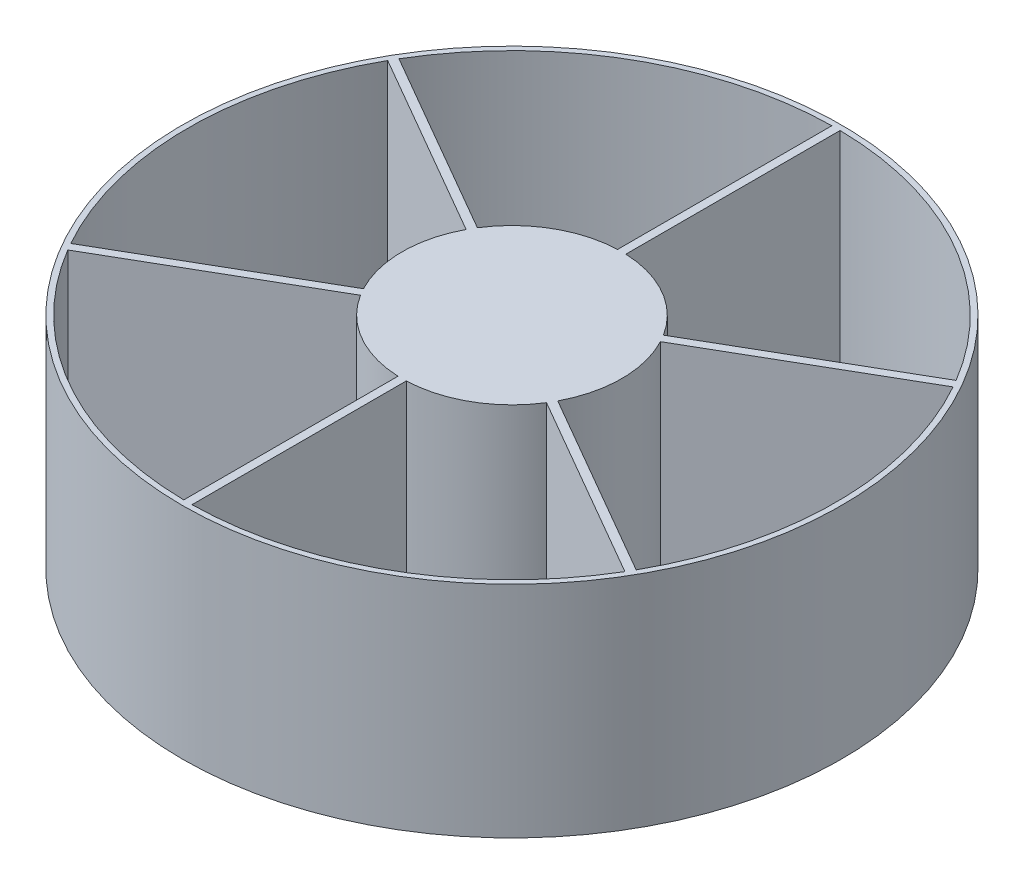
ISO-10303-21;
HEADER;
FILE_DESCRIPTION(('STEP AP214'),'2;1');
FILE_NAME('part.step','',(''),(''),'','','');
FILE_SCHEMA(('AUTOMOTIVE_DESIGN { 1 0 10303 214 1 1 1 1 }'));
ENDSEC;
DATA;
#1=APPLICATION_CONTEXT('core data for automotive mechanical design processes');
#2=APPLICATION_PROTOCOL_DEFINITION('international standard','automotive_design',2000,#1);
#3=PRODUCT_CONTEXT('',#1,'mechanical');
#4=PRODUCT('Part','Part','',(#3));
#5=PRODUCT_RELATED_PRODUCT_CATEGORY('part','',(#4));
#6=PRODUCT_DEFINITION_FORMATION('','',#4);
#7=PRODUCT_DEFINITION_CONTEXT('part definition',#1,'design');
#8=PRODUCT_DEFINITION('design','',#6,#7);
#9=PRODUCT_DEFINITION_SHAPE('','',#8);
#10=(LENGTH_UNIT() NAMED_UNIT(*) SI_UNIT(.MILLI.,.METRE.));
#11=(NAMED_UNIT(*) PLANE_ANGLE_UNIT() SI_UNIT($,.RADIAN.));
#12=(NAMED_UNIT(*) SI_UNIT($,.STERADIAN.) SOLID_ANGLE_UNIT());
#13=UNCERTAINTY_MEASURE_WITH_UNIT(LENGTH_MEASURE(1.E-05),#10,'distance_accuracy_value','');
#14=(GEOMETRIC_REPRESENTATION_CONTEXT(3) GLOBAL_UNCERTAINTY_ASSIGNED_CONTEXT((#13)) GLOBAL_UNIT_ASSIGNED_CONTEXT((#10,
#11,#12)) REPRESENTATION_CONTEXT('',''));
#15=CARTESIAN_POINT('',(0.,0.,0.));
#16=DIRECTION('',(0.,0.,1.));
#17=DIRECTION('',(1.,0.,0.));
#18=AXIS2_PLACEMENT_3D('',#15,#16,#17);
#19=CARTESIAN_POINT('',(0.,80.,0.));
#20=DIRECTION('',(0.,-1.,0.));
#21=DIRECTION('',(0.,0.,-1.));
#22=AXIS2_PLACEMENT_3D('',#19,#20,#21);
#23=CYLINDRICAL_SURFACE('',#22,38.);
#24=CARTESIAN_POINT('',(0.,0.,0.));
#25=DIRECTION('',(0.,1.,0.));
#26=DIRECTION('',(0.,0.,1.));
#27=AXIS2_PLACEMENT_3D('',#24,#25,#26);
#28=CIRCLE('',#27,38.);
#29=CARTESIAN_POINT('',(0.,0.,38.));
#30=VERTEX_POINT('',#29);
#31=EDGE_CURVE('E390',#30,#30,#28,.T.);
#32=ORIENTED_EDGE('',*,*,#31,.F.);
#33=EDGE_LOOP('',(#32));
#34=FACE_BOUND('',#33,.T.);
#35=CARTESIAN_POINT('',(0.,75.,0.));
#36=DIRECTION('',(0.,-1.,0.));
#37=DIRECTION('',(0.,0.,-1.));
#38=AXIS2_PLACEMENT_3D('',#35,#36,#37);
#39=CIRCLE('',#38,38.);
#40=CARTESIAN_POINT('',(0.,75.,-38.));
#41=VERTEX_POINT('',#40);
#42=EDGE_CURVE('E231',#41,#41,#39,.T.);
#43=ORIENTED_EDGE('',*,*,#42,.F.);
#44=EDGE_LOOP('',(#43));
#45=FACE_BOUND('',#44,.T.);
#46=ADVANCED_FACE('F43',(#34,#45),#23,.F.);
#47=CARTESIAN_POINT('',(0.,2.,0.));
#48=DIRECTION('',(0.,1.,0.));
#49=DIRECTION('',(0.,0.,1.));
#50=AXIS2_PLACEMENT_3D('',#47,#48,#49);
#51=PLANE('',#50);
#52=DIRECTION('',(-0.866025403784435,0.,0.500000000000006));
#53=VECTOR('',#52,1.);
#54=CARTESIAN_POINT('',(102.932740714858,2.,-57.6961947525815));
#55=LINE('',#54,#53);
#56=CARTESIAN_POINT('',(102.932740714858,2.,-57.6961947525815));
#57=VERTEX_POINT('',#56);
#58=CARTESIAN_POINT('',(35.3666506178744,2.,-18.6868944469969));
#59=VERTEX_POINT('',#58);
#60=EDGE_CURVE('E244',#57,#59,#55,.T.);
#61=ORIENTED_EDGE('',*,*,#60,.T.);
#62=CARTESIAN_POINT('',(0.,2.,0.));
#63=DIRECTION('',(0.,1.,0.));
#64=DIRECTION('',(0.,0.,1.));
#65=AXIS2_PLACEMENT_3D('',#62,#63,#64);
#66=CIRCLE('',#65,40.);
#67=CARTESIAN_POINT('',(35.3666506178748,2.,18.6868944469962));
#68=VERTEX_POINT('',#67);
#69=EDGE_CURVE('E928',#68,#59,#66,.T.);
#70=ORIENTED_EDGE('',*,*,#69,.F.);
#71=DIRECTION('',(0.866025403784441,0.,0.499999999999996));
#72=VECTOR('',#71,1.);
#73=CARTESIAN_POINT('',(102.932740714859,2.,57.69619475258));
#74=LINE('',#73,#72);
#75=CARTESIAN_POINT('',(102.932740714859,2.,57.69619475258));
#76=VERTEX_POINT('',#75);
#77=EDGE_CURVE('E268',#68,#76,#74,.T.);
#78=ORIENTED_EDGE('',*,*,#77,.T.);
#79=CARTESIAN_POINT('',(0.,2.,0.));
#80=DIRECTION('',(0.,1.,0.));
#81=DIRECTION('',(0.,0.,1.));
#82=AXIS2_PLACEMENT_3D('',#79,#80,#81);
#83=CIRCLE('',#82,118.);
#84=EDGE_CURVE('E942',#76,#57,#83,.T.);
#85=ORIENTED_EDGE('',*,*,#84,.T.);
#86=EDGE_LOOP('',(#61,#70,#78,#85));
#87=FACE_BOUND('',#86,.T.);
#88=ADVANCED_FACE('F415',(#87),#51,.T.);
#89=CARTESIAN_POINT('',(0.,80.,0.));
#90=DIRECTION('',(0.,-1.,0.));
#91=DIRECTION('',(0.,0.,-1.));
#92=AXIS2_PLACEMENT_3D('',#89,#90,#91);
#93=CYLINDRICAL_SURFACE('',#92,118.);
#94=DIRECTION('',(0.,1.,0.));
#95=VECTOR('',#94,1.);
#96=CARTESIAN_POINT('',(102.932740714858,-78.6306305439,-57.6961947525815));
#97=LINE('',#96,#95);
#98=CARTESIAN_POINT('',(102.932740714858,80.,-57.6961947525815));
#99=VERTEX_POINT('',#98);
#100=EDGE_CURVE('E248',#57,#99,#97,.T.);
#101=ORIENTED_EDGE('',*,*,#100,.F.);
#102=ORIENTED_EDGE('',*,*,#84,.F.);
#103=DIRECTION('',(0.,1.,0.));
#104=VECTOR('',#103,1.);
#105=CARTESIAN_POINT('',(102.932740714859,-78.6306305438999,57.69619475258));
#106=LINE('',#105,#104);
#107=CARTESIAN_POINT('',(102.932740714859,80.,57.69619475258));
#108=VERTEX_POINT('',#107);
#109=EDGE_CURVE('E274',#76,#108,#106,.T.);
#110=ORIENTED_EDGE('',*,*,#109,.T.);
#111=CARTESIAN_POINT('',(0.,80.,0.));
#112=DIRECTION('',(0.,1.,0.));
#113=DIRECTION('',(0.,0.,1.));
#114=AXIS2_PLACEMENT_3D('',#111,#112,#113);
#115=CIRCLE('',#114,118.);
#116=EDGE_CURVE('E969',#108,#99,#115,.T.);
#117=ORIENTED_EDGE('',*,*,#116,.T.);
#118=EDGE_LOOP('',(#101,#102,#110,#117));
#119=FACE_BOUND('',#118,.T.);
#120=ADVANCED_FACE('F421',(#119),#93,.F.);
#121=CARTESIAN_POINT('',(0.,80.,0.));
#122=DIRECTION('',(0.,-1.,0.));
#123=DIRECTION('',(0.,0.,-1.));
#124=AXIS2_PLACEMENT_3D('',#121,#122,#123);
#125=CYLINDRICAL_SURFACE('',#124,40.);
#126=ORIENTED_EDGE('',*,*,#69,.T.);
#127=DIRECTION('',(0.,1.,0.));
#128=VECTOR('',#127,1.);
#129=CARTESIAN_POINT('',(35.3666506178744,-78.6306305439,-18.6868944469969));
#130=LINE('',#129,#128);
#131=CARTESIAN_POINT('',(35.3666506178744,80.,-18.6868944469969));
#132=VERTEX_POINT('',#131);
#133=EDGE_CURVE('E255',#59,#132,#130,.T.);
#134=ORIENTED_EDGE('',*,*,#133,.T.);
#135=CARTESIAN_POINT('',(0.,80.,0.));
#136=DIRECTION('',(0.,1.,0.));
#137=DIRECTION('',(0.,0.,1.));
#138=AXIS2_PLACEMENT_3D('',#135,#136,#137);
#139=CIRCLE('',#138,40.);
#140=CARTESIAN_POINT('',(35.3666506178748,80.,18.6868944469962));
#141=VERTEX_POINT('',#140);
#142=EDGE_CURVE('E963',#141,#132,#139,.T.);
#143=ORIENTED_EDGE('',*,*,#142,.F.);
#144=DIRECTION('',(0.,1.,0.));
#145=VECTOR('',#144,1.);
#146=CARTESIAN_POINT('',(35.3666506178748,-78.6306305438999,18.6868944469962));
#147=LINE('',#146,#145);
#148=EDGE_CURVE('E279',#68,#141,#147,.T.);
#149=ORIENTED_EDGE('',*,*,#148,.F.);
#150=EDGE_LOOP('',(#126,#134,#143,#149));
#151=FACE_BOUND('',#150,.T.);
#152=ADVANCED_FACE('F433',(#151),#125,.T.);
#153=DIRECTION('',(-0.866025403784441,0.,-0.499999999999996));
#154=VECTOR('',#153,1.);
#155=CARTESIAN_POINT('',(101.432740714859,2.,60.2942709639334));
#156=LINE('',#155,#154);
#157=CARTESIAN_POINT('',(101.432740714859,2.,60.2942709639334));
#158=VERTEX_POINT('',#157);
#159=CARTESIAN_POINT('',(33.8666506178748,2.,21.2849706583495));
#160=VERTEX_POINT('',#159);
#161=EDGE_CURVE('E265',#158,#160,#156,.T.);
#162=ORIENTED_EDGE('',*,*,#161,.T.);
#163=CARTESIAN_POINT('',(1.49999999999997,2.,39.9718651053463));
#164=VERTEX_POINT('',#163);
#165=EDGE_CURVE('E924',#164,#160,#66,.T.);
#166=ORIENTED_EDGE('',*,*,#165,.F.);
#167=DIRECTION('',(0.,0.,1.));
#168=VECTOR('',#167,1.);
#169=CARTESIAN_POINT('',(1.4999999999996,2.,117.990465716515));
#170=LINE('',#169,#168);
#171=CARTESIAN_POINT('',(1.4999999999996,2.,117.990465716515));
#172=VERTEX_POINT('',#171);
#173=EDGE_CURVE('E290',#164,#172,#170,.T.);
#174=ORIENTED_EDGE('',*,*,#173,.T.);
#175=EDGE_CURVE('E944',#172,#158,#83,.T.);
#176=ORIENTED_EDGE('',*,*,#175,.T.);
#177=EDGE_LOOP('',(#162,#166,#174,#176));
#178=FACE_BOUND('',#177,.T.);
#179=ADVANCED_FACE('F424',(#178),#51,.T.);
#180=DIRECTION('',(0.,1.,0.));
#181=VECTOR('',#180,1.);
#182=CARTESIAN_POINT('',(101.432740714859,-78.6306305438999,60.2942709639334));
#183=LINE('',#182,#181);
#184=CARTESIAN_POINT('',(101.432740714859,80.,60.2942709639334));
#185=VERTEX_POINT('',#184);
#186=EDGE_CURVE('E269',#158,#185,#183,.T.);
#187=ORIENTED_EDGE('',*,*,#186,.F.);
#188=ORIENTED_EDGE('',*,*,#175,.F.);
#189=DIRECTION('',(0.,1.,0.));
#190=VECTOR('',#189,1.);
#191=CARTESIAN_POINT('',(1.4999999999996,-76.0857851029128,117.990465716515));
#192=LINE('',#191,#190);
#193=CARTESIAN_POINT('',(1.4999999999996,80.,117.990465716515));
#194=VERTEX_POINT('',#193);
#195=EDGE_CURVE('E296',#172,#194,#192,.T.);
#196=ORIENTED_EDGE('',*,*,#195,.T.);
#197=EDGE_CURVE('E971',#194,#185,#115,.T.);
#198=ORIENTED_EDGE('',*,*,#197,.T.);
#199=EDGE_LOOP('',(#187,#188,#196,#198));
#200=FACE_BOUND('',#199,.T.);
#201=ADVANCED_FACE('F651',(#200),#93,.F.);
#202=ORIENTED_EDGE('',*,*,#165,.T.);
#203=DIRECTION('',(0.,1.,0.));
#204=VECTOR('',#203,1.);
#205=CARTESIAN_POINT('',(33.8666506178748,-78.6306305438999,21.2849706583495));
#206=LINE('',#205,#204);
#207=CARTESIAN_POINT('',(33.8666506178748,80.,21.2849706583495));
#208=VERTEX_POINT('',#207);
#209=EDGE_CURVE('E276',#160,#208,#206,.T.);
#210=ORIENTED_EDGE('',*,*,#209,.T.);
#211=CARTESIAN_POINT('',(1.49999999999997,80.,39.9718651053463));
#212=VERTEX_POINT('',#211);
#213=EDGE_CURVE('E959',#212,#208,#139,.T.);
#214=ORIENTED_EDGE('',*,*,#213,.F.);
#215=DIRECTION('',(0.,1.,0.));
#216=VECTOR('',#215,1.);
#217=CARTESIAN_POINT('',(1.49999999999997,-76.0857851029128,39.9718651053463));
#218=LINE('',#217,#216);
#219=EDGE_CURVE('E301',#164,#212,#218,.T.);
#220=ORIENTED_EDGE('',*,*,#219,.F.);
#221=EDGE_LOOP('',(#202,#210,#214,#220));
#222=FACE_BOUND('',#221,.T.);
#223=ADVANCED_FACE('F661',(#222),#125,.T.);
#224=DIRECTION('',(0.,0.,-1.));
#225=VECTOR('',#224,1.);
#226=CARTESIAN_POINT('',(-1.5000000000004,2.,117.990465716515));
#227=LINE('',#226,#225);
#228=CARTESIAN_POINT('',(-1.5000000000004,2.,117.990465716515));
#229=VERTEX_POINT('',#228);
#230=CARTESIAN_POINT('',(-1.50000000000002,2.,39.9718651053463));
#231=VERTEX_POINT('',#230);
#232=EDGE_CURVE('E287',#229,#231,#227,.T.);
#233=ORIENTED_EDGE('',*,*,#232,.T.);
#234=CARTESIAN_POINT('',(-33.8666506178746,2.,21.2849706583499));
#235=VERTEX_POINT('',#234);
#236=EDGE_CURVE('E922',#235,#231,#66,.T.);
#237=ORIENTED_EDGE('',*,*,#236,.F.);
#238=DIRECTION('',(-0.866025403784439,0.,0.5));
#239=VECTOR('',#238,1.);
#240=CARTESIAN_POINT('',(-101.432740714858,2.,60.2942709639341));
#241=LINE('',#240,#239);
#242=CARTESIAN_POINT('',(-101.432740714858,2.,60.2942709639341));
#243=VERTEX_POINT('',#242);
#244=EDGE_CURVE('E312',#235,#243,#241,.T.);
#245=ORIENTED_EDGE('',*,*,#244,.T.);
#246=EDGE_CURVE('E947',#243,#229,#83,.T.);
#247=ORIENTED_EDGE('',*,*,#246,.T.);
#248=EDGE_LOOP('',(#233,#237,#245,#247));
#249=FACE_BOUND('',#248,.T.);
#250=ADVANCED_FACE('F671',(#249),#51,.T.);
#251=DIRECTION('',(0.,1.,0.));
#252=VECTOR('',#251,1.);
#253=CARTESIAN_POINT('',(-1.5000000000004,-76.0857851029128,117.990465716515));
#254=LINE('',#253,#252);
#255=CARTESIAN_POINT('',(-1.5000000000004,80.,117.990465716515));
#256=VERTEX_POINT('',#255);
#257=EDGE_CURVE('E291',#229,#256,#254,.T.);
#258=ORIENTED_EDGE('',*,*,#257,.F.);
#259=ORIENTED_EDGE('',*,*,#246,.F.);
#260=DIRECTION('',(0.,1.,0.));
#261=VECTOR('',#260,1.);
#262=CARTESIAN_POINT('',(-101.432740714858,-78.6306305439,60.2942709639341));
#263=LINE('',#262,#261);
#264=CARTESIAN_POINT('',(-101.432740714858,80.,60.2942709639341));
#265=VERTEX_POINT('',#264);
#266=EDGE_CURVE('E318',#243,#265,#263,.T.);
#267=ORIENTED_EDGE('',*,*,#266,.T.);
#268=EDGE_CURVE('E975',#265,#256,#115,.T.);
#269=ORIENTED_EDGE('',*,*,#268,.T.);
#270=EDGE_LOOP('',(#258,#259,#267,#269));
#271=FACE_BOUND('',#270,.T.);
#272=ADVANCED_FACE('F681',(#271),#93,.F.);
#273=ORIENTED_EDGE('',*,*,#236,.T.);
#274=DIRECTION('',(0.,1.,0.));
#275=VECTOR('',#274,1.);
#276=CARTESIAN_POINT('',(-1.50000000000002,-76.0857851029128,39.9718651053463));
#277=LINE('',#276,#275);
#278=CARTESIAN_POINT('',(-1.50000000000002,80.,39.9718651053463));
#279=VERTEX_POINT('',#278);
#280=EDGE_CURVE('E298',#231,#279,#277,.T.);
#281=ORIENTED_EDGE('',*,*,#280,.T.);
#282=CARTESIAN_POINT('',(-33.8666506178745,80.,21.2849706583499));
#283=VERTEX_POINT('',#282);
#284=EDGE_CURVE('E957',#283,#279,#139,.T.);
#285=ORIENTED_EDGE('',*,*,#284,.F.);
#286=DIRECTION('',(0.,1.,0.));
#287=VECTOR('',#286,1.);
#288=CARTESIAN_POINT('',(-33.8666506178746,-78.6306305439,21.2849706583499));
#289=LINE('',#288,#287);
#290=EDGE_CURVE('E323',#235,#283,#289,.T.);
#291=ORIENTED_EDGE('',*,*,#290,.F.);
#292=EDGE_LOOP('',(#273,#281,#285,#291));
#293=FACE_BOUND('',#292,.T.);
#294=ADVANCED_FACE('F691',(#293),#125,.T.);
#295=DIRECTION('',(0.866025403784439,0.,-0.5));
#296=VECTOR('',#295,1.);
#297=CARTESIAN_POINT('',(-102.932740714858,2.,57.6961947525808));
#298=LINE('',#297,#296);
#299=CARTESIAN_POINT('',(-102.932740714858,2.,57.6961947525808));
#300=VERTEX_POINT('',#299);
#301=CARTESIAN_POINT('',(-35.3666506178746,2.,18.6868944469966));
#302=VERTEX_POINT('',#301);
#303=EDGE_CURVE('E309',#300,#302,#298,.T.);
#304=ORIENTED_EDGE('',*,*,#303,.T.);
#305=CARTESIAN_POINT('',(-35.3666506178747,2.,-18.6868944469964));
#306=VERTEX_POINT('',#305);
#307=EDGE_CURVE('E386',#306,#302,#66,.T.);
#308=ORIENTED_EDGE('',*,*,#307,.F.);
#309=DIRECTION('',(-0.866025403784437,0.,-0.500000000000002));
#310=VECTOR('',#309,1.);
#311=CARTESIAN_POINT('',(-102.932740714858,2.,-57.6961947525807));
#312=LINE('',#311,#310);
#313=CARTESIAN_POINT('',(-102.932740714858,2.,-57.6961947525807));
#314=VERTEX_POINT('',#313);
#315=EDGE_CURVE('E334',#306,#314,#312,.T.);
#316=ORIENTED_EDGE('',*,*,#315,.T.);
#317=EDGE_CURVE('E380',#314,#300,#83,.T.);
#318=ORIENTED_EDGE('',*,*,#317,.T.);
#319=EDGE_LOOP('',(#304,#308,#316,#318));
#320=FACE_BOUND('',#319,.T.);
#321=ADVANCED_FACE('F701',(#320),#51,.T.);
#322=DIRECTION('',(0.,1.,0.));
#323=VECTOR('',#322,1.);
#324=CARTESIAN_POINT('',(-102.932740714858,-78.6306305439,57.6961947525808));
#325=LINE('',#324,#323);
#326=CARTESIAN_POINT('',(-102.932740714858,80.,57.6961947525808));
#327=VERTEX_POINT('',#326);
#328=EDGE_CURVE('E313',#300,#327,#325,.T.);
#329=ORIENTED_EDGE('',*,*,#328,.F.);
#330=ORIENTED_EDGE('',*,*,#317,.F.);
#331=DIRECTION('',(0.,1.,0.));
#332=VECTOR('',#331,1.);
#333=CARTESIAN_POINT('',(-102.932740714858,-78.6306305439,-57.6961947525807));
#334=LINE('',#333,#332);
#335=CARTESIAN_POINT('',(-102.932740714858,80.,-57.6961947525807));
#336=VERTEX_POINT('',#335);
#337=EDGE_CURVE('E340',#314,#336,#334,.T.);
#338=ORIENTED_EDGE('',*,*,#337,.T.);
#339=EDGE_CURVE('E391',#336,#327,#115,.T.);
#340=ORIENTED_EDGE('',*,*,#339,.T.);
#341=EDGE_LOOP('',(#329,#330,#338,#340));
#342=FACE_BOUND('',#341,.T.);
#343=ADVANCED_FACE('F711',(#342),#93,.F.);
#344=ORIENTED_EDGE('',*,*,#307,.T.);
#345=DIRECTION('',(0.,1.,0.));
#346=VECTOR('',#345,1.);
#347=CARTESIAN_POINT('',(-35.3666506178746,-78.6306305439,18.6868944469966));
#348=LINE('',#347,#346);
#349=CARTESIAN_POINT('',(-35.3666506178746,80.,18.6868944469966));
#350=VERTEX_POINT('',#349);
#351=EDGE_CURVE('E320',#302,#350,#348,.T.);
#352=ORIENTED_EDGE('',*,*,#351,.T.);
#353=CARTESIAN_POINT('',(-35.3666506178747,80.,-18.6868944469964));
#354=VERTEX_POINT('',#353);
#355=EDGE_CURVE('E395',#354,#350,#139,.T.);
#356=ORIENTED_EDGE('',*,*,#355,.F.);
#357=DIRECTION('',(0.,1.,0.));
#358=VECTOR('',#357,1.);
#359=CARTESIAN_POINT('',(-35.3666506178747,-78.6306305439,-18.6868944469964));
#360=LINE('',#359,#358);
#361=EDGE_CURVE('E345',#306,#354,#360,.T.);
#362=ORIENTED_EDGE('',*,*,#361,.F.);
#363=EDGE_LOOP('',(#344,#352,#356,#362));
#364=FACE_BOUND('',#363,.T.);
#365=ADVANCED_FACE('F721',(#364),#125,.T.);
#366=DIRECTION('',(0.866025403784437,0.,0.500000000000002));
#367=VECTOR('',#366,1.);
#368=CARTESIAN_POINT('',(-101.432740714858,2.,-60.2942709639341));
#369=LINE('',#368,#367);
#370=CARTESIAN_POINT('',(-101.432740714858,2.,-60.2942709639341));
#371=VERTEX_POINT('',#370);
#372=CARTESIAN_POINT('',(-33.8666506178747,2.,-21.2849706583497));
#373=VERTEX_POINT('',#372);
#374=EDGE_CURVE('E331',#371,#373,#369,.T.);
#375=ORIENTED_EDGE('',*,*,#374,.T.);
#376=CARTESIAN_POINT('',(-1.49999999999997,2.,-39.9718651053463));
#377=VERTEX_POINT('',#376);
#378=EDGE_CURVE('E382',#377,#373,#66,.T.);
#379=ORIENTED_EDGE('',*,*,#378,.F.);
#380=DIRECTION('',(0.,0.,-1.));
#381=VECTOR('',#380,1.);
#382=CARTESIAN_POINT('',(-1.4999999999996,2.,-117.990465716515));
#383=LINE('',#382,#381);
#384=CARTESIAN_POINT('',(-1.4999999999996,2.,-117.990465716515));
#385=VERTEX_POINT('',#384);
#386=EDGE_CURVE('E356',#377,#385,#383,.T.);
#387=ORIENTED_EDGE('',*,*,#386,.T.);
#388=EDGE_CURVE('E376',#385,#371,#83,.T.);
#389=ORIENTED_EDGE('',*,*,#388,.T.);
#390=EDGE_LOOP('',(#375,#379,#387,#389));
#391=FACE_BOUND('',#390,.T.);
#392=ADVANCED_FACE('F440',(#391),#51,.T.);
#393=DIRECTION('',(0.,1.,0.));
#394=VECTOR('',#393,1.);
#395=CARTESIAN_POINT('',(-101.432740714858,-78.6306305439,-60.2942709639341));
#396=LINE('',#395,#394);
#397=CARTESIAN_POINT('',(-101.432740714858,80.,-60.2942709639341));
#398=VERTEX_POINT('',#397);
#399=EDGE_CURVE('E335',#371,#398,#396,.T.);
#400=ORIENTED_EDGE('',*,*,#399,.F.);
#401=ORIENTED_EDGE('',*,*,#388,.F.);
#402=DIRECTION('',(0.,1.,0.));
#403=VECTOR('',#402,1.);
#404=CARTESIAN_POINT('',(-1.4999999999996,-76.0857851029128,-117.990465716515));
#405=LINE('',#404,#403);
#406=CARTESIAN_POINT('',(-1.4999999999996,80.,-117.990465716515));
#407=VERTEX_POINT('',#406);
#408=EDGE_CURVE('E362',#385,#407,#405,.T.);
#409=ORIENTED_EDGE('',*,*,#408,.T.);
#410=EDGE_CURVE('E387',#407,#398,#115,.T.);
#411=ORIENTED_EDGE('',*,*,#410,.T.);
#412=EDGE_LOOP('',(#400,#401,#409,#411));
#413=FACE_BOUND('',#412,.T.);
#414=ADVANCED_FACE('F436',(#413),#93,.F.);
#415=ORIENTED_EDGE('',*,*,#378,.T.);
#416=DIRECTION('',(0.,1.,0.));
#417=VECTOR('',#416,1.);
#418=CARTESIAN_POINT('',(-33.8666506178747,-78.6306305439,-21.2849706583497));
#419=LINE('',#418,#417);
#420=CARTESIAN_POINT('',(-33.8666506178747,80.,-21.2849706583497));
#421=VERTEX_POINT('',#420);
#422=EDGE_CURVE('E342',#373,#421,#419,.T.);
#423=ORIENTED_EDGE('',*,*,#422,.T.);
#424=CARTESIAN_POINT('',(-1.49999999999997,80.,-39.9718651053463));
#425=VERTEX_POINT('',#424);
#426=EDGE_CURVE('E392',#425,#421,#139,.T.);
#427=ORIENTED_EDGE('',*,*,#426,.F.);
#428=DIRECTION('',(0.,1.,0.));
#429=VECTOR('',#428,1.);
#430=CARTESIAN_POINT('',(-1.49999999999997,-76.0857851029128,-39.9718651053463));
#431=LINE('',#430,#429);
#432=EDGE_CURVE('E368',#377,#425,#431,.T.);
#433=ORIENTED_EDGE('',*,*,#432,.F.);
#434=EDGE_LOOP('',(#415,#423,#427,#433));
#435=FACE_BOUND('',#434,.T.);
#436=ADVANCED_FACE('F412',(#435),#125,.T.);
#437=CARTESIAN_POINT('',(0.,80.,0.));
#438=DIRECTION('',(0.,1.,0.));
#439=DIRECTION('',(0.,0.,1.));
#440=AXIS2_PLACEMENT_3D('',#437,#438,#439);
#441=PLANE('',#440);
#442=CARTESIAN_POINT('',(101.432740714858,80.,-60.2942709639348));
#443=VERTEX_POINT('',#442);
#444=CARTESIAN_POINT('',(1.5000000000004,80.,-117.990465716515));
#445=VERTEX_POINT('',#444);
#446=EDGE_CURVE('E379',#443,#445,#115,.T.);
#447=ORIENTED_EDGE('',*,*,#446,.F.);
#448=DIRECTION('',(-0.866025403784435,0.,0.500000000000006));
#449=VECTOR('',#448,1.);
#450=CARTESIAN_POINT('',(101.432740714858,80.,-60.2942709639348));
#451=LINE('',#450,#449);
#452=CARTESIAN_POINT('',(33.8666506178744,80.,-21.2849706583502));
#453=VERTEX_POINT('',#452);
#454=EDGE_CURVE('E66',#443,#453,#451,.T.);
#455=ORIENTED_EDGE('',*,*,#454,.T.);
#456=CARTESIAN_POINT('',(1.50000000000002,80.,-39.9718651053463));
#457=VERTEX_POINT('',#456);
#458=EDGE_CURVE('E385',#453,#457,#139,.T.);
#459=ORIENTED_EDGE('',*,*,#458,.T.);
#460=DIRECTION('',(0.,0.,-1.));
#461=VECTOR('',#460,1.);
#462=CARTESIAN_POINT('',(1.5000000000004,80.,-117.990465716515));
#463=LINE('',#462,#461);
#464=EDGE_CURVE('E359',#457,#445,#463,.T.);
#465=ORIENTED_EDGE('',*,*,#464,.T.);
#466=EDGE_LOOP('',(#447,#455,#459,#465));
#467=FACE_BOUND('',#466,.T.);
#468=ORIENTED_EDGE('',*,*,#116,.F.);
#469=DIRECTION('',(-0.866025403784441,0.,-0.499999999999996));
#470=VECTOR('',#469,1.);
#471=CARTESIAN_POINT('',(102.932740714859,80.,57.69619475258));
#472=LINE('',#471,#470);
#473=EDGE_CURVE('E264',#108,#141,#472,.T.);
#474=ORIENTED_EDGE('',*,*,#473,.T.);
#475=ORIENTED_EDGE('',*,*,#142,.T.);
#476=DIRECTION('',(0.866025403784435,0.,-0.500000000000006));
#477=VECTOR('',#476,1.);
#478=CARTESIAN_POINT('',(102.932740714858,80.,-57.6961947525815));
#479=LINE('',#478,#477);
#480=EDGE_CURVE('E250',#132,#99,#479,.T.);
#481=ORIENTED_EDGE('',*,*,#480,.T.);
#482=EDGE_LOOP('',(#468,#474,#475,#481));
#483=FACE_BOUND('',#482,.T.);
#484=ORIENTED_EDGE('',*,*,#197,.F.);
#485=DIRECTION('',(0.,0.,-1.));
#486=VECTOR('',#485,1.);
#487=CARTESIAN_POINT('',(1.4999999999996,80.,117.990465716515));
#488=LINE('',#487,#486);
#489=EDGE_CURVE('E286',#194,#212,#488,.T.);
#490=ORIENTED_EDGE('',*,*,#489,.T.);
#491=ORIENTED_EDGE('',*,*,#213,.T.);
#492=DIRECTION('',(0.866025403784441,0.,0.499999999999996));
#493=VECTOR('',#492,1.);
#494=CARTESIAN_POINT('',(101.432740714859,80.,60.2942709639334));
#495=LINE('',#494,#493);
#496=EDGE_CURVE('E271',#208,#185,#495,.T.);
#497=ORIENTED_EDGE('',*,*,#496,.T.);
#498=EDGE_LOOP('',(#484,#490,#491,#497));
#499=FACE_BOUND('',#498,.T.);
#500=ORIENTED_EDGE('',*,*,#268,.F.);
#501=DIRECTION('',(0.866025403784439,0.,-0.5));
#502=VECTOR('',#501,1.);
#503=CARTESIAN_POINT('',(-101.432740714858,80.,60.2942709639341));
#504=LINE('',#503,#502);
#505=EDGE_CURVE('E308',#265,#283,#504,.T.);
#506=ORIENTED_EDGE('',*,*,#505,.T.);
#507=ORIENTED_EDGE('',*,*,#284,.T.);
#508=DIRECTION('',(0.,0.,1.));
#509=VECTOR('',#508,1.);
#510=CARTESIAN_POINT('',(-1.5000000000004,80.,117.990465716515));
#511=LINE('',#510,#509);
#512=EDGE_CURVE('E293',#279,#256,#511,.T.);
#513=ORIENTED_EDGE('',*,*,#512,.T.);
#514=EDGE_LOOP('',(#500,#506,#507,#513));
#515=FACE_BOUND('',#514,.T.);
#516=ORIENTED_EDGE('',*,*,#339,.F.);
#517=DIRECTION('',(0.866025403784437,0.,0.500000000000002));
#518=VECTOR('',#517,1.);
#519=CARTESIAN_POINT('',(-102.932740714858,80.,-57.6961947525807));
#520=LINE('',#519,#518);
#521=EDGE_CURVE('E330',#336,#354,#520,.T.);
#522=ORIENTED_EDGE('',*,*,#521,.T.);
#523=ORIENTED_EDGE('',*,*,#355,.T.);
#524=DIRECTION('',(-0.866025403784439,0.,0.5));
#525=VECTOR('',#524,1.);
#526=CARTESIAN_POINT('',(-102.932740714858,80.,57.6961947525808));
#527=LINE('',#526,#525);
#528=EDGE_CURVE('E315',#350,#327,#527,.T.);
#529=ORIENTED_EDGE('',*,*,#528,.T.);
#530=EDGE_LOOP('',(#516,#522,#523,#529));
#531=FACE_BOUND('',#530,.T.);
#532=ORIENTED_EDGE('',*,*,#410,.F.);
#533=DIRECTION('',(0.,0.,1.));
#534=VECTOR('',#533,1.);
#535=CARTESIAN_POINT('',(-1.4999999999996,80.,-117.990465716515));
#536=LINE('',#535,#534);
#537=EDGE_CURVE('E352',#407,#425,#536,.T.);
#538=ORIENTED_EDGE('',*,*,#537,.T.);
#539=ORIENTED_EDGE('',*,*,#426,.T.);
#540=DIRECTION('',(-0.866025403784437,0.,-0.500000000000002));
#541=VECTOR('',#540,1.);
#542=CARTESIAN_POINT('',(-101.432740714858,80.,-60.2942709639341));
#543=LINE('',#542,#541);
#544=EDGE_CURVE('E337',#421,#398,#543,.T.);
#545=ORIENTED_EDGE('',*,*,#544,.T.);
#546=EDGE_LOOP('',(#532,#538,#539,#545));
#547=FACE_BOUND('',#546,.T.);
#548=CARTESIAN_POINT('',(0.,80.,0.));
#549=DIRECTION('',(0.,1.,0.));
#550=DIRECTION('',(0.,0.,1.));
#551=AXIS2_PLACEMENT_3D('',#548,#549,#550);
#552=CIRCLE('',#551,120.);
#553=CARTESIAN_POINT('',(0.,80.,120.));
#554=VERTEX_POINT('',#553);
#555=EDGE_CURVE('E12',#554,#554,#552,.T.);
#556=ORIENTED_EDGE('',*,*,#555,.T.);
#557=EDGE_LOOP('',(#556));
#558=FACE_BOUND('',#557,.T.);
#559=ADVANCED_FACE('F405',(#467,#483,#499,#515,#531,#547,#558),#441,.T.);
#560=CARTESIAN_POINT('',(0.,0.,0.));
#561=DIRECTION('',(0.,1.,0.));
#562=DIRECTION('',(0.,0.,1.));
#563=AXIS2_PLACEMENT_3D('',#560,#561,#562);
#564=PLANE('',#563);
#565=CARTESIAN_POINT('',(0.,0.,0.));
#566=DIRECTION('',(0.,1.,0.));
#567=DIRECTION('',(0.,0.,1.));
#568=AXIS2_PLACEMENT_3D('',#565,#566,#567);
#569=CIRCLE('',#568,120.);
#570=CARTESIAN_POINT('',(0.,0.,120.));
#571=VERTEX_POINT('',#570);
#572=EDGE_CURVE('E47',#571,#571,#569,.T.);
#573=ORIENTED_EDGE('',*,*,#572,.F.);
#574=EDGE_LOOP('',(#573));
#575=FACE_BOUND('',#574,.T.);
#576=ORIENTED_EDGE('',*,*,#31,.T.);
#577=EDGE_LOOP('',(#576));
#578=FACE_BOUND('',#577,.T.);
#579=ADVANCED_FACE('F403',(#575,#578),#564,.F.);
#580=CARTESIAN_POINT('',(0.,80.,0.));
#581=DIRECTION('',(0.,-1.,0.));
#582=DIRECTION('',(0.,0.,-1.));
#583=AXIS2_PLACEMENT_3D('',#580,#581,#582);
#584=CYLINDRICAL_SURFACE('',#583,120.);
#585=ORIENTED_EDGE('',*,*,#555,.F.);
#586=EDGE_LOOP('',(#585));
#587=FACE_BOUND('',#586,.T.);
#588=ORIENTED_EDGE('',*,*,#572,.T.);
#589=EDGE_LOOP('',(#588));
#590=FACE_BOUND('',#589,.T.);
#591=ADVANCED_FACE('F45',(#587,#590),#584,.T.);
#592=DIRECTION('',(0.866025403784435,0.,-0.500000000000006));
#593=VECTOR('',#592,1.);
#594=CARTESIAN_POINT('',(101.432740714858,2.,-60.2942709639348));
#595=LINE('',#594,#593);
#596=CARTESIAN_POINT('',(33.8666506178744,2.,-21.2849706583502));
#597=VERTEX_POINT('',#596);
#598=CARTESIAN_POINT('',(101.432740714858,2.,-60.2942709639348));
#599=VERTEX_POINT('',#598);
#600=EDGE_CURVE('E247',#597,#599,#595,.T.);
#601=ORIENTED_EDGE('',*,*,#600,.T.);
#602=CARTESIAN_POINT('',(1.5000000000004,2.,-117.990465716515));
#603=VERTEX_POINT('',#602);
#604=EDGE_CURVE('E381',#599,#603,#83,.T.);
#605=ORIENTED_EDGE('',*,*,#604,.T.);
#606=DIRECTION('',(0.,0.,1.));
#607=VECTOR('',#606,1.);
#608=CARTESIAN_POINT('',(1.5000000000004,2.,-117.990465716515));
#609=LINE('',#608,#607);
#610=CARTESIAN_POINT('',(1.50000000000002,2.,-39.9718651053463));
#611=VERTEX_POINT('',#610);
#612=EDGE_CURVE('E353',#603,#611,#609,.T.);
#613=ORIENTED_EDGE('',*,*,#612,.T.);
#614=EDGE_CURVE('E375',#597,#611,#66,.T.);
#615=ORIENTED_EDGE('',*,*,#614,.F.);
#616=EDGE_LOOP('',(#601,#605,#613,#615));
#617=FACE_BOUND('',#616,.T.);
#618=ADVANCED_FACE('F410',(#617),#51,.T.);
#619=DIRECTION('',(0.,1.,0.));
#620=VECTOR('',#619,1.);
#621=CARTESIAN_POINT('',(101.432740714858,-78.6306305439,-60.2942709639348));
#622=LINE('',#621,#620);
#623=EDGE_CURVE('E253',#599,#443,#622,.T.);
#624=ORIENTED_EDGE('',*,*,#623,.T.);
#625=ORIENTED_EDGE('',*,*,#446,.T.);
#626=DIRECTION('',(0.,1.,0.));
#627=VECTOR('',#626,1.);
#628=CARTESIAN_POINT('',(1.5000000000004,-76.0857851029128,-117.990465716515));
#629=LINE('',#628,#627);
#630=EDGE_CURVE('E357',#603,#445,#629,.T.);
#631=ORIENTED_EDGE('',*,*,#630,.F.);
#632=ORIENTED_EDGE('',*,*,#604,.F.);
#633=EDGE_LOOP('',(#624,#625,#631,#632));
#634=FACE_BOUND('',#633,.T.);
#635=ADVANCED_FACE('F431',(#634),#93,.F.);
#636=ORIENTED_EDGE('',*,*,#458,.F.);
#637=DIRECTION('',(0.,1.,0.));
#638=VECTOR('',#637,1.);
#639=CARTESIAN_POINT('',(33.8666506178744,-78.6306305439,-21.2849706583502));
#640=LINE('',#639,#638);
#641=EDGE_CURVE('E258',#597,#453,#640,.T.);
#642=ORIENTED_EDGE('',*,*,#641,.F.);
#643=ORIENTED_EDGE('',*,*,#614,.T.);
#644=DIRECTION('',(0.,1.,0.));
#645=VECTOR('',#644,1.);
#646=CARTESIAN_POINT('',(1.50000000000002,-76.0857851029128,-39.9718651053463));
#647=LINE('',#646,#645);
#648=EDGE_CURVE('E365',#611,#457,#647,.T.);
#649=ORIENTED_EDGE('',*,*,#648,.T.);
#650=EDGE_LOOP('',(#636,#642,#643,#649));
#651=FACE_BOUND('',#650,.T.);
#652=ADVANCED_FACE('F427',(#651),#125,.T.);
#653=CARTESIAN_POINT('',(1.5000000000004,-76.0857851029128,-117.990465716515));
#654=DIRECTION('',(1.,0.,0.));
#655=DIRECTION('',(0.,0.,-1.));
#656=AXIS2_PLACEMENT_3D('',#653,#654,#655);
#657=PLANE('',#656);
#658=ORIENTED_EDGE('',*,*,#612,.F.);
#659=ORIENTED_EDGE('',*,*,#630,.T.);
#660=ORIENTED_EDGE('',*,*,#464,.F.);
#661=ORIENTED_EDGE('',*,*,#648,.F.);
#662=EDGE_LOOP('',(#658,#659,#660,#661));
#663=FACE_BOUND('',#662,.T.);
#664=ADVANCED_FACE('F430',(#663),#657,.T.);
#665=CARTESIAN_POINT('',(-1.4999999999996,-76.0857851029128,-117.990465716515));
#666=DIRECTION('',(-1.,0.,0.));
#667=DIRECTION('',(0.,0.,1.));
#668=AXIS2_PLACEMENT_3D('',#665,#666,#667);
#669=PLANE('',#668);
#670=ORIENTED_EDGE('',*,*,#386,.F.);
#671=ORIENTED_EDGE('',*,*,#432,.T.);
#672=ORIENTED_EDGE('',*,*,#537,.F.);
#673=ORIENTED_EDGE('',*,*,#408,.F.);
#674=EDGE_LOOP('',(#670,#671,#672,#673));
#675=FACE_BOUND('',#674,.T.);
#676=ADVANCED_FACE('F441',(#675),#669,.T.);
#677=CARTESIAN_POINT('',(-101.432740714858,-78.6306305439,-60.2942709639341));
#678=DIRECTION('',(0.500000000000002,0.,-0.866025403784437));
#679=DIRECTION('',(-0.866025403784437,0.,-0.500000000000002));
#680=AXIS2_PLACEMENT_3D('',#677,#678,#679);
#681=PLANE('',#680);
#682=ORIENTED_EDGE('',*,*,#374,.F.);
#683=ORIENTED_EDGE('',*,*,#399,.T.);
#684=ORIENTED_EDGE('',*,*,#544,.F.);
#685=ORIENTED_EDGE('',*,*,#422,.F.);
#686=EDGE_LOOP('',(#682,#683,#684,#685));
#687=FACE_BOUND('',#686,.T.);
#688=ADVANCED_FACE('F444',(#687),#681,.T.);
#689=CARTESIAN_POINT('',(-102.932740714858,-78.6306305439,-57.6961947525807));
#690=DIRECTION('',(-0.500000000000002,0.,0.866025403784437));
#691=DIRECTION('',(0.866025403784437,0.,0.500000000000002));
#692=AXIS2_PLACEMENT_3D('',#689,#690,#691);
#693=PLANE('',#692);
#694=ORIENTED_EDGE('',*,*,#315,.F.);
#695=ORIENTED_EDGE('',*,*,#361,.T.);
#696=ORIENTED_EDGE('',*,*,#521,.F.);
#697=ORIENTED_EDGE('',*,*,#337,.F.);
#698=EDGE_LOOP('',(#694,#695,#696,#697));
#699=FACE_BOUND('',#698,.T.);
#700=ADVANCED_FACE('F449',(#699),#693,.T.);
#701=CARTESIAN_POINT('',(-102.932740714858,-78.6306305439,57.6961947525808));
#702=DIRECTION('',(-0.5,0.,-0.866025403784439));
#703=DIRECTION('',(-0.866025403784439,0.,0.5));
#704=AXIS2_PLACEMENT_3D('',#701,#702,#703);
#705=PLANE('',#704);
#706=ORIENTED_EDGE('',*,*,#303,.F.);
#707=ORIENTED_EDGE('',*,*,#328,.T.);
#708=ORIENTED_EDGE('',*,*,#528,.F.);
#709=ORIENTED_EDGE('',*,*,#351,.F.);
#710=EDGE_LOOP('',(#706,#707,#708,#709));
#711=FACE_BOUND('',#710,.T.);
#712=ADVANCED_FACE('F452',(#711),#705,.T.);
#713=CARTESIAN_POINT('',(-101.432740714858,-78.6306305439,60.2942709639341));
#714=DIRECTION('',(0.5,0.,0.866025403784439));
#715=DIRECTION('',(0.866025403784439,0.,-0.5));
#716=AXIS2_PLACEMENT_3D('',#713,#714,#715);
#717=PLANE('',#716);
#718=ORIENTED_EDGE('',*,*,#244,.F.);
#719=ORIENTED_EDGE('',*,*,#290,.T.);
#720=ORIENTED_EDGE('',*,*,#505,.F.);
#721=ORIENTED_EDGE('',*,*,#266,.F.);
#722=EDGE_LOOP('',(#718,#719,#720,#721));
#723=FACE_BOUND('',#722,.T.);
#724=ADVANCED_FACE('F457',(#723),#717,.T.);
#725=CARTESIAN_POINT('',(-1.5000000000004,-76.0857851029128,117.990465716515));
#726=DIRECTION('',(-1.,0.,0.));
#727=DIRECTION('',(0.,0.,1.));
#728=AXIS2_PLACEMENT_3D('',#725,#726,#727);
#729=PLANE('',#728);
#730=ORIENTED_EDGE('',*,*,#232,.F.);
#731=ORIENTED_EDGE('',*,*,#257,.T.);
#732=ORIENTED_EDGE('',*,*,#512,.F.);
#733=ORIENTED_EDGE('',*,*,#280,.F.);
#734=EDGE_LOOP('',(#730,#731,#732,#733));
#735=FACE_BOUND('',#734,.T.);
#736=ADVANCED_FACE('F460',(#735),#729,.T.);
#737=CARTESIAN_POINT('',(1.4999999999996,-76.0857851029128,117.990465716515));
#738=DIRECTION('',(1.,0.,0.));
#739=DIRECTION('',(0.,0.,-1.));
#740=AXIS2_PLACEMENT_3D('',#737,#738,#739);
#741=PLANE('',#740);
#742=ORIENTED_EDGE('',*,*,#173,.F.);
#743=ORIENTED_EDGE('',*,*,#219,.T.);
#744=ORIENTED_EDGE('',*,*,#489,.F.);
#745=ORIENTED_EDGE('',*,*,#195,.F.);
#746=EDGE_LOOP('',(#742,#743,#744,#745));
#747=FACE_BOUND('',#746,.T.);
#748=ADVANCED_FACE('F465',(#747),#741,.T.);
#749=CARTESIAN_POINT('',(101.432740714859,-78.6306305438999,60.2942709639334));
#750=DIRECTION('',(-0.499999999999996,0.,0.866025403784441));
#751=DIRECTION('',(0.866025403784441,0.,0.499999999999996));
#752=AXIS2_PLACEMENT_3D('',#749,#750,#751);
#753=PLANE('',#752);
#754=ORIENTED_EDGE('',*,*,#161,.F.);
#755=ORIENTED_EDGE('',*,*,#186,.T.);
#756=ORIENTED_EDGE('',*,*,#496,.F.);
#757=ORIENTED_EDGE('',*,*,#209,.F.);
#758=EDGE_LOOP('',(#754,#755,#756,#757));
#759=FACE_BOUND('',#758,.T.);
#760=ADVANCED_FACE('F468',(#759),#753,.T.);
#761=CARTESIAN_POINT('',(102.932740714859,-78.6306305438999,57.69619475258));
#762=DIRECTION('',(0.499999999999996,0.,-0.866025403784441));
#763=DIRECTION('',(-0.866025403784441,0.,-0.499999999999996));
#764=AXIS2_PLACEMENT_3D('',#761,#762,#763);
#765=PLANE('',#764);
#766=ORIENTED_EDGE('',*,*,#77,.F.);
#767=ORIENTED_EDGE('',*,*,#148,.T.);
#768=ORIENTED_EDGE('',*,*,#473,.F.);
#769=ORIENTED_EDGE('',*,*,#109,.F.);
#770=EDGE_LOOP('',(#766,#767,#768,#769));
#771=FACE_BOUND('',#770,.T.);
#772=ADVANCED_FACE('F473',(#771),#765,.T.);
#773=CARTESIAN_POINT('',(102.932740714858,-78.6306305439,-57.6961947525815));
#774=DIRECTION('',(0.500000000000006,0.,0.866025403784435));
#775=DIRECTION('',(0.866025403784435,0.,-0.500000000000006));
#776=AXIS2_PLACEMENT_3D('',#773,#774,#775);
#777=PLANE('',#776);
#778=ORIENTED_EDGE('',*,*,#60,.F.);
#779=ORIENTED_EDGE('',*,*,#100,.T.);
#780=ORIENTED_EDGE('',*,*,#480,.F.);
#781=ORIENTED_EDGE('',*,*,#133,.F.);
#782=EDGE_LOOP('',(#778,#779,#780,#781));
#783=FACE_BOUND('',#782,.T.);
#784=ADVANCED_FACE('F476',(#783),#777,.T.);
#785=CARTESIAN_POINT('',(101.432740714858,-78.6306305439,-60.2942709639348));
#786=DIRECTION('',(-0.500000000000006,0.,-0.866025403784435));
#787=DIRECTION('',(-0.866025403784435,0.,0.500000000000006));
#788=AXIS2_PLACEMENT_3D('',#785,#786,#787);
#789=PLANE('',#788);
#790=ORIENTED_EDGE('',*,*,#600,.F.);
#791=ORIENTED_EDGE('',*,*,#641,.T.);
#792=ORIENTED_EDGE('',*,*,#454,.F.);
#793=ORIENTED_EDGE('',*,*,#623,.F.);
#794=EDGE_LOOP('',(#790,#791,#792,#793));
#795=FACE_BOUND('',#794,.T.);
#796=ADVANCED_FACE('F481',(#795),#789,.T.);
#797=CARTESIAN_POINT('',(0.,75.,0.));
#798=DIRECTION('',(0.,-1.,0.));
#799=DIRECTION('',(0.,0.,-1.));
#800=AXIS2_PLACEMENT_3D('',#797,#798,#799);
#801=PLANE('',#800);
#802=CARTESIAN_POINT('',(0.,75.,0.));
#803=DIRECTION('',(0.,-1.,0.));
#804=DIRECTION('',(0.,0.,-1.));
#805=AXIS2_PLACEMENT_3D('',#802,#803,#804);
#806=CIRCLE('',#805,5.);
#807=CARTESIAN_POINT('',(0.,75.,-5.));
#808=VERTEX_POINT('',#807);
#809=EDGE_CURVE('E234',#808,#808,#806,.T.);
#810=ORIENTED_EDGE('',*,*,#809,.F.);
#811=EDGE_LOOP('',(#810));
#812=FACE_BOUND('',#811,.T.);
#813=ORIENTED_EDGE('',*,*,#42,.T.);
#814=EDGE_LOOP('',(#813));
#815=FACE_BOUND('',#814,.T.);
#816=ADVANCED_FACE('F484',(#812,#815),#801,.T.);
#817=CARTESIAN_POINT('',(0.,67.,0.));
#818=DIRECTION('',(0.,-1.,0.));
#819=DIRECTION('',(0.,0.,-1.));
#820=AXIS2_PLACEMENT_3D('',#817,#818,#819);
#821=PLANE('',#820);
#822=CARTESIAN_POINT('',(0.,67.,0.));
#823=DIRECTION('',(0.,-1.,0.));
#824=DIRECTION('',(0.,0.,-1.));
#825=AXIS2_PLACEMENT_3D('',#822,#823,#824);
#826=CIRCLE('',#825,2.6);
#827=CARTESIAN_POINT('',(-2.04939015319192,67.,1.6));
#828=VERTEX_POINT('',#827);
#829=CARTESIAN_POINT('',(-2.04939015319192,67.,-1.6));
#830=VERTEX_POINT('',#829);
#831=EDGE_CURVE('E219',#828,#830,#826,.F.);
#832=ORIENTED_EDGE('',*,*,#831,.F.);
#833=DIRECTION('',(0.,0.,1.));
#834=VECTOR('',#833,1.);
#835=CARTESIAN_POINT('',(-2.04939015319192,67.,1.6));
#836=LINE('',#835,#834);
#837=EDGE_CURVE('E239',#830,#828,#836,.T.);
#838=ORIENTED_EDGE('',*,*,#837,.F.);
#839=EDGE_LOOP('',(#832,#838));
#840=FACE_BOUND('',#839,.T.);
#841=ADVANCED_FACE('F499',(#840),#821,.T.);
#842=CARTESIAN_POINT('',(-2.04939015319192,92.9754447024256,1.6));
#843=DIRECTION('',(-1.,0.,0.));
#844=DIRECTION('',(0.,0.,1.));
#845=AXIS2_PLACEMENT_3D('',#842,#843,#844);
#846=PLANE('',#845);
#847=ORIENTED_EDGE('',*,*,#837,.T.);
#848=DIRECTION('',(0.,-1.,0.));
#849=VECTOR('',#848,1.);
#850=CARTESIAN_POINT('',(-2.04939015319192,92.9754447024256,1.6));
#851=LINE('',#850,#849);
#852=CARTESIAN_POINT('',(-2.04939015319192,48.,1.6));
#853=VERTEX_POINT('',#852);
#854=EDGE_CURVE('E222',#828,#853,#851,.T.);
#855=ORIENTED_EDGE('',*,*,#854,.T.);
#856=DIRECTION('',(0.,0.,-1.));
#857=VECTOR('',#856,1.);
#858=CARTESIAN_POINT('',(-2.04939015319192,48.,1.6));
#859=LINE('',#858,#857);
#860=CARTESIAN_POINT('',(-2.04939015319192,48.,-1.6));
#861=VERTEX_POINT('',#860);
#862=EDGE_CURVE('E225',#853,#861,#859,.T.);
#863=ORIENTED_EDGE('',*,*,#862,.T.);
#864=DIRECTION('',(0.,-1.,0.));
#865=VECTOR('',#864,1.);
#866=CARTESIAN_POINT('',(-2.04939015319192,92.9754447024256,-1.6));
#867=LINE('',#866,#865);
#868=EDGE_CURVE('E215',#830,#861,#867,.T.);
#869=ORIENTED_EDGE('',*,*,#868,.F.);
#870=EDGE_LOOP('',(#847,#855,#863,#869));
#871=FACE_BOUND('',#870,.T.);
#872=ADVANCED_FACE('F226',(#871),#846,.F.);
#873=CARTESIAN_POINT('',(0.,92.9754447024256,0.));
#874=DIRECTION('',(0.,-1.,0.));
#875=DIRECTION('',(0.,0.,-1.));
#876=AXIS2_PLACEMENT_3D('',#873,#874,#875);
#877=CYLINDRICAL_SURFACE('',#876,2.6);
#878=ORIENTED_EDGE('',*,*,#831,.T.);
#879=ORIENTED_EDGE('',*,*,#868,.T.);
#880=CARTESIAN_POINT('',(0.,48.,0.));
#881=DIRECTION('',(0.,-1.,0.));
#882=DIRECTION('',(0.,0.,-1.));
#883=AXIS2_PLACEMENT_3D('',#880,#881,#882);
#884=CIRCLE('',#883,2.6);
#885=EDGE_CURVE('E58',#861,#853,#884,.T.);
#886=ORIENTED_EDGE('',*,*,#885,.T.);
#887=ORIENTED_EDGE('',*,*,#854,.F.);
#888=EDGE_LOOP('',(#878,#879,#886,#887));
#889=FACE_BOUND('',#888,.T.);
#890=ADVANCED_FACE('F217',(#889),#877,.F.);
#891=CARTESIAN_POINT('',(0.,48.,0.));
#892=DIRECTION('',(0.,-1.,0.));
#893=DIRECTION('',(0.,0.,-1.));
#894=AXIS2_PLACEMENT_3D('',#891,#892,#893);
#895=PLANE('',#894);
#896=ORIENTED_EDGE('',*,*,#885,.F.);
#897=ORIENTED_EDGE('',*,*,#862,.F.);
#898=EDGE_LOOP('',(#896,#897));
#899=FACE_BOUND('',#898,.T.);
#900=CARTESIAN_POINT('',(0.,48.,0.));
#901=DIRECTION('',(0.,-1.,0.));
#902=DIRECTION('',(0.,0.,-1.));
#903=AXIS2_PLACEMENT_3D('',#900,#901,#902);
#904=CIRCLE('',#903,5.);
#905=CARTESIAN_POINT('',(0.,48.,-5.));
#906=VERTEX_POINT('',#905);
#907=EDGE_CURVE('E241',#906,#906,#904,.T.);
#908=ORIENTED_EDGE('',*,*,#907,.T.);
#909=EDGE_LOOP('',(#908));
#910=FACE_BOUND('',#909,.T.);
#911=ADVANCED_FACE('F229',(#899,#910),#895,.T.);
#912=CARTESIAN_POINT('',(0.,48.,0.));
#913=DIRECTION('',(0.,1.,0.));
#914=DIRECTION('',(0.,0.,1.));
#915=AXIS2_PLACEMENT_3D('',#912,#913,#914);
#916=CYLINDRICAL_SURFACE('',#915,5.);
#917=ORIENTED_EDGE('',*,*,#907,.F.);
#918=EDGE_LOOP('',(#917));
#919=FACE_BOUND('',#918,.T.);
#920=ORIENTED_EDGE('',*,*,#809,.T.);
#921=EDGE_LOOP('',(#920));
#922=FACE_BOUND('',#921,.T.);
#923=ADVANCED_FACE('F489',(#919,#922),#916,.T.);
#924=CLOSED_SHELL('',(#46,#88,#120,#152,#179,#201,#223,#250,#272,#294,#321,#343,#365,#392,#414,
#436,#559,#579,#591,#618,#635,#652,#664,#676,#688,#700,#712,#724,#736,#748,#760,#772,#784,#796,
#816,#841,#872,#890,#911,#923));
#925=MANIFOLD_SOLID_BREP('B2',#924);
#926=ADVANCED_BREP_SHAPE_REPRESENTATION('',(#18,#925),#14);
#927=SHAPE_DEFINITION_REPRESENTATION(#9,#926);
ENDSEC;
END-ISO-10303-21;
